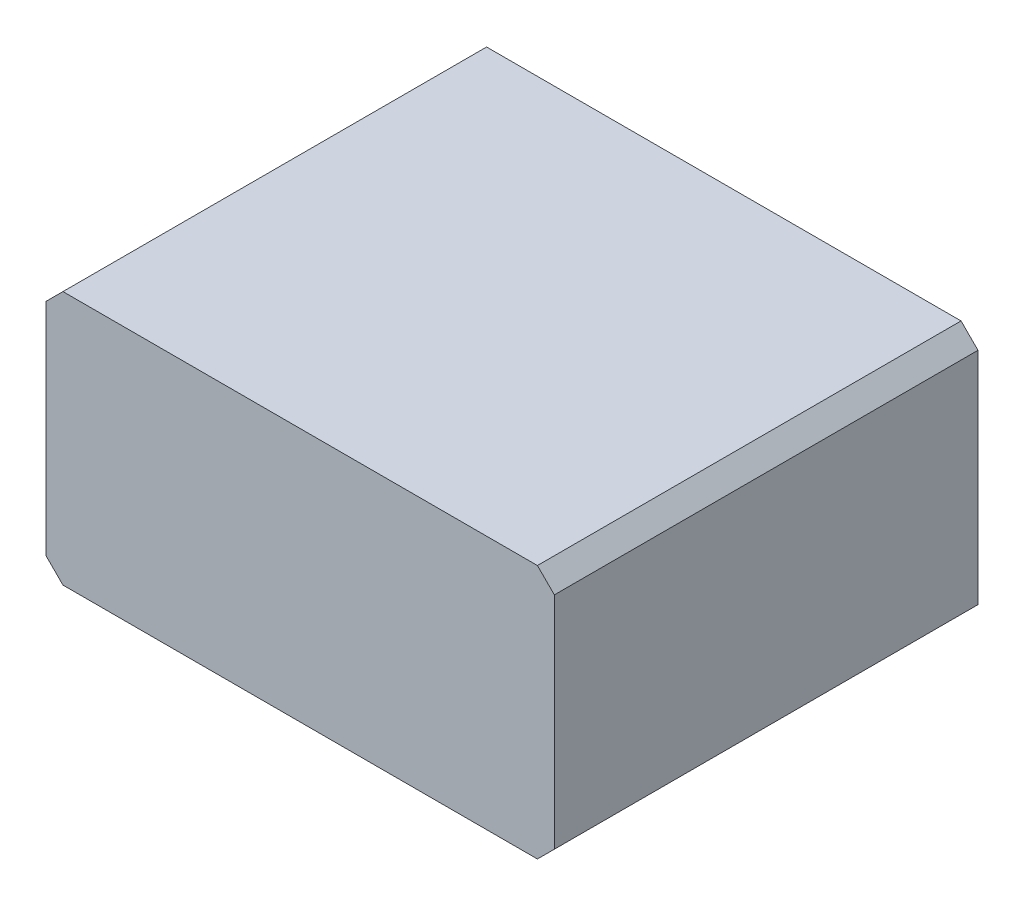
ISO-10303-21;
HEADER;
FILE_DESCRIPTION(('STEP AP214'),'2;1');
FILE_NAME('part.step','',(''),(''),'','','');
FILE_SCHEMA(('AUTOMOTIVE_DESIGN { 1 0 10303 214 1 1 1 1 }'));
ENDSEC;
DATA;
#1=APPLICATION_CONTEXT('core data for automotive mechanical design processes');
#2=APPLICATION_PROTOCOL_DEFINITION('international standard','automotive_design',2000,#1);
#3=PRODUCT_CONTEXT('',#1,'mechanical');
#4=PRODUCT('Part','Part','',(#3));
#5=PRODUCT_RELATED_PRODUCT_CATEGORY('part','',(#4));
#6=PRODUCT_DEFINITION_FORMATION('','',#4);
#7=PRODUCT_DEFINITION_CONTEXT('part definition',#1,'design');
#8=PRODUCT_DEFINITION('design','',#6,#7);
#9=PRODUCT_DEFINITION_SHAPE('','',#8);
#10=(LENGTH_UNIT() NAMED_UNIT(*) SI_UNIT(.MILLI.,.METRE.));
#11=(NAMED_UNIT(*) PLANE_ANGLE_UNIT() SI_UNIT($,.RADIAN.));
#12=(NAMED_UNIT(*) SI_UNIT($,.STERADIAN.) SOLID_ANGLE_UNIT());
#13=UNCERTAINTY_MEASURE_WITH_UNIT(LENGTH_MEASURE(1.E-05),#10,'distance_accuracy_value','');
#14=(GEOMETRIC_REPRESENTATION_CONTEXT(3) GLOBAL_UNCERTAINTY_ASSIGNED_CONTEXT((#13)) GLOBAL_UNIT_ASSIGNED_CONTEXT((#10,
#11,#12)) REPRESENTATION_CONTEXT('',''));
#15=CARTESIAN_POINT('',(0.,0.,0.));
#16=DIRECTION('',(0.,0.,1.));
#17=DIRECTION('',(1.,0.,0.));
#18=AXIS2_PLACEMENT_3D('',#15,#16,#17);
#19=CARTESIAN_POINT('',(30.,15.,25.));
#20=DIRECTION('',(-1.,0.,0.));
#21=DIRECTION('',(0.,0.,1.));
#22=AXIS2_PLACEMENT_3D('',#19,#20,#21);
#23=PLANE('',#22);
#24=DIRECTION('',(0.,1.,0.));
#25=VECTOR('',#24,1.);
#26=CARTESIAN_POINT('',(30.,15.,25.));
#27=LINE('',#26,#25);
#28=CARTESIAN_POINT('',(30.,-13.,25.));
#29=VERTEX_POINT('',#28);
#30=CARTESIAN_POINT('',(30.,13.,25.));
#31=VERTEX_POINT('',#30);
#32=EDGE_CURVE('E129',#29,#31,#27,.T.);
#33=ORIENTED_EDGE('',*,*,#32,.F.);
#34=DIRECTION('',(0.,0.,-1.));
#35=VECTOR('',#34,1.);
#36=CARTESIAN_POINT('',(30.,-13.,25.));
#37=LINE('',#36,#35);
#38=CARTESIAN_POINT('',(30.,-13.,-25.));
#39=VERTEX_POINT('',#38);
#40=EDGE_CURVE('E11',#29,#39,#37,.T.);
#41=ORIENTED_EDGE('',*,*,#40,.T.);
#42=DIRECTION('',(0.,1.,0.));
#43=VECTOR('',#42,1.);
#44=CARTESIAN_POINT('',(30.,15.,-25.));
#45=LINE('',#44,#43);
#46=CARTESIAN_POINT('',(30.,13.,-25.));
#47=VERTEX_POINT('',#46);
#48=EDGE_CURVE('E160',#39,#47,#45,.T.);
#49=ORIENTED_EDGE('',*,*,#48,.T.);
#50=DIRECTION('',(0.,0.,1.));
#51=VECTOR('',#50,1.);
#52=CARTESIAN_POINT('',(30.,13.,25.));
#53=LINE('',#52,#51);
#54=EDGE_CURVE('E43',#47,#31,#53,.T.);
#55=ORIENTED_EDGE('',*,*,#54,.T.);
#56=EDGE_LOOP('',(#33,#41,#49,#55));
#57=FACE_BOUND('',#56,.T.);
#58=ADVANCED_FACE('F35',(#57),#23,.F.);
#59=CARTESIAN_POINT('',(-30.,15.,25.));
#60=DIRECTION('',(0.,-1.,0.));
#61=DIRECTION('',(0.,0.,-1.));
#62=AXIS2_PLACEMENT_3D('',#59,#60,#61);
#63=PLANE('',#62);
#64=DIRECTION('',(-1.,0.,0.));
#65=VECTOR('',#64,1.);
#66=CARTESIAN_POINT('',(-30.,15.,-25.));
#67=LINE('',#66,#65);
#68=CARTESIAN_POINT('',(28.,15.,-25.));
#69=VERTEX_POINT('',#68);
#70=CARTESIAN_POINT('',(-28.,15.,-25.));
#71=VERTEX_POINT('',#70);
#72=EDGE_CURVE('E134',#69,#71,#67,.T.);
#73=ORIENTED_EDGE('',*,*,#72,.T.);
#74=DIRECTION('',(0.,0.,1.));
#75=VECTOR('',#74,1.);
#76=CARTESIAN_POINT('',(-28.,15.,25.));
#77=LINE('',#76,#75);
#78=CARTESIAN_POINT('',(-28.,15.,25.));
#79=VERTEX_POINT('',#78);
#80=EDGE_CURVE('E50',#71,#79,#77,.T.);
#81=ORIENTED_EDGE('',*,*,#80,.T.);
#82=DIRECTION('',(-1.,0.,0.));
#83=VECTOR('',#82,1.);
#84=CARTESIAN_POINT('',(-30.,15.,25.));
#85=LINE('',#84,#83);
#86=CARTESIAN_POINT('',(28.,15.,25.));
#87=VERTEX_POINT('',#86);
#88=EDGE_CURVE('E132',#87,#79,#85,.T.);
#89=ORIENTED_EDGE('',*,*,#88,.F.);
#90=DIRECTION('',(0.,0.,-1.));
#91=VECTOR('',#90,1.);
#92=CARTESIAN_POINT('',(28.,15.,25.));
#93=LINE('',#92,#91);
#94=EDGE_CURVE('E152',#87,#69,#93,.T.);
#95=ORIENTED_EDGE('',*,*,#94,.T.);
#96=EDGE_LOOP('',(#73,#81,#89,#95));
#97=FACE_BOUND('',#96,.T.);
#98=ADVANCED_FACE('F167',(#97),#63,.F.);
#99=CARTESIAN_POINT('',(-30.,15.,25.));
#100=DIRECTION('',(1.,0.,0.));
#101=DIRECTION('',(0.,0.,-1.));
#102=AXIS2_PLACEMENT_3D('',#99,#100,#101);
#103=PLANE('',#102);
#104=DIRECTION('',(0.,-1.,0.));
#105=VECTOR('',#104,1.);
#106=CARTESIAN_POINT('',(-30.,15.,-25.));
#107=LINE('',#106,#105);
#108=CARTESIAN_POINT('',(-30.,13.,-25.));
#109=VERTEX_POINT('',#108);
#110=CARTESIAN_POINT('',(-30.,-13.,-25.));
#111=VERTEX_POINT('',#110);
#112=EDGE_CURVE('E130',#109,#111,#107,.T.);
#113=ORIENTED_EDGE('',*,*,#112,.T.);
#114=DIRECTION('',(0.,0.,1.));
#115=VECTOR('',#114,1.);
#116=CARTESIAN_POINT('',(-30.,-13.,25.));
#117=LINE('',#116,#115);
#118=CARTESIAN_POINT('',(-30.,-13.,25.));
#119=VERTEX_POINT('',#118);
#120=EDGE_CURVE('E107',#111,#119,#117,.T.);
#121=ORIENTED_EDGE('',*,*,#120,.T.);
#122=DIRECTION('',(0.,-1.,0.));
#123=VECTOR('',#122,1.);
#124=CARTESIAN_POINT('',(-30.,15.,25.));
#125=LINE('',#124,#123);
#126=CARTESIAN_POINT('',(-30.,13.,25.));
#127=VERTEX_POINT('',#126);
#128=EDGE_CURVE('E171',#127,#119,#125,.T.);
#129=ORIENTED_EDGE('',*,*,#128,.F.);
#130=DIRECTION('',(0.,0.,-1.));
#131=VECTOR('',#130,1.);
#132=CARTESIAN_POINT('',(-30.,13.,25.));
#133=LINE('',#132,#131);
#134=EDGE_CURVE('E112',#127,#109,#133,.T.);
#135=ORIENTED_EDGE('',*,*,#134,.T.);
#136=EDGE_LOOP('',(#113,#121,#129,#135));
#137=FACE_BOUND('',#136,.T.);
#138=ADVANCED_FACE('F179',(#137),#103,.F.);
#139=CARTESIAN_POINT('',(-30.,-15.,25.));
#140=DIRECTION('',(0.,1.,0.));
#141=DIRECTION('',(0.,0.,1.));
#142=AXIS2_PLACEMENT_3D('',#139,#140,#141);
#143=PLANE('',#142);
#144=DIRECTION('',(1.,0.,0.));
#145=VECTOR('',#144,1.);
#146=CARTESIAN_POINT('',(-30.,-15.,25.));
#147=LINE('',#146,#145);
#148=CARTESIAN_POINT('',(-28.,-15.,25.));
#149=VERTEX_POINT('',#148);
#150=CARTESIAN_POINT('',(28.,-15.,25.));
#151=VERTEX_POINT('',#150);
#152=EDGE_CURVE('E122',#149,#151,#147,.T.);
#153=ORIENTED_EDGE('',*,*,#152,.F.);
#154=DIRECTION('',(0.,0.,-1.));
#155=VECTOR('',#154,1.);
#156=CARTESIAN_POINT('',(-28.,-15.,25.));
#157=LINE('',#156,#155);
#158=CARTESIAN_POINT('',(-28.,-15.,-25.));
#159=VERTEX_POINT('',#158);
#160=EDGE_CURVE('E106',#149,#159,#157,.T.);
#161=ORIENTED_EDGE('',*,*,#160,.T.);
#162=DIRECTION('',(1.,0.,0.));
#163=VECTOR('',#162,1.);
#164=CARTESIAN_POINT('',(-30.,-15.,-25.));
#165=LINE('',#164,#163);
#166=CARTESIAN_POINT('',(28.,-15.,-25.));
#167=VERTEX_POINT('',#166);
#168=EDGE_CURVE('E119',#159,#167,#165,.T.);
#169=ORIENTED_EDGE('',*,*,#168,.T.);
#170=DIRECTION('',(0.,0.,1.));
#171=VECTOR('',#170,1.);
#172=CARTESIAN_POINT('',(28.,-15.,25.));
#173=LINE('',#172,#171);
#174=EDGE_CURVE('E124',#167,#151,#173,.T.);
#175=ORIENTED_EDGE('',*,*,#174,.T.);
#176=EDGE_LOOP('',(#153,#161,#169,#175));
#177=FACE_BOUND('',#176,.T.);
#178=ADVANCED_FACE('F118',(#177),#143,.F.);
#179=CARTESIAN_POINT('',(0.,0.,25.));
#180=DIRECTION('',(0.,0.,1.));
#181=DIRECTION('',(1.,0.,0.));
#182=AXIS2_PLACEMENT_3D('',#179,#180,#181);
#183=PLANE('',#182);
#184=ORIENTED_EDGE('',*,*,#128,.T.);
#185=DIRECTION('',(-0.707106781186547,0.707106781186548,0.));
#186=VECTOR('',#185,1.);
#187=CARTESIAN_POINT('',(-21.5,-21.5,25.));
#188=LINE('',#187,#186);
#189=EDGE_CURVE('E150',#119,#149,#188,.F.);
#190=ORIENTED_EDGE('',*,*,#189,.T.);
#191=ORIENTED_EDGE('',*,*,#152,.T.);
#192=DIRECTION('',(-0.707106781186548,-0.707106781186547,0.));
#193=VECTOR('',#192,1.);
#194=CARTESIAN_POINT('',(21.5,-21.5,25.));
#195=LINE('',#194,#193);
#196=EDGE_CURVE('E146',#151,#29,#195,.F.);
#197=ORIENTED_EDGE('',*,*,#196,.T.);
#198=ORIENTED_EDGE('',*,*,#32,.T.);
#199=DIRECTION('',(0.707106781186548,-0.707106781186548,0.));
#200=VECTOR('',#199,1.);
#201=CARTESIAN_POINT('',(21.5,21.5,25.));
#202=LINE('',#201,#200);
#203=EDGE_CURVE('E57',#31,#87,#202,.F.);
#204=ORIENTED_EDGE('',*,*,#203,.T.);
#205=ORIENTED_EDGE('',*,*,#88,.T.);
#206=DIRECTION('',(0.707106781186549,0.707106781186546,0.));
#207=VECTOR('',#206,1.);
#208=CARTESIAN_POINT('',(-21.5,21.5,25.));
#209=LINE('',#208,#207);
#210=EDGE_CURVE('E148',#79,#127,#209,.F.);
#211=ORIENTED_EDGE('',*,*,#210,.T.);
#212=EDGE_LOOP('',(#184,#190,#191,#197,#198,#204,#205,#211));
#213=FACE_BOUND('',#212,.T.);
#214=ADVANCED_FACE('F163',(#213),#183,.T.);
#215=CARTESIAN_POINT('',(0.,0.,-25.));
#216=DIRECTION('',(0.,0.,1.));
#217=DIRECTION('',(1.,0.,0.));
#218=AXIS2_PLACEMENT_3D('',#215,#216,#217);
#219=PLANE('',#218);
#220=ORIENTED_EDGE('',*,*,#168,.F.);
#221=DIRECTION('',(0.707106781186547,-0.707106781186548,0.));
#222=VECTOR('',#221,1.);
#223=CARTESIAN_POINT('',(-28.,-15.,-25.));
#224=LINE('',#223,#222);
#225=EDGE_CURVE('E102',#159,#111,#224,.F.);
#226=ORIENTED_EDGE('',*,*,#225,.T.);
#227=ORIENTED_EDGE('',*,*,#112,.F.);
#228=DIRECTION('',(-0.707106781186549,-0.707106781186546,0.));
#229=VECTOR('',#228,1.);
#230=CARTESIAN_POINT('',(-30.,13.,-25.));
#231=LINE('',#230,#229);
#232=EDGE_CURVE('E113',#109,#71,#231,.F.);
#233=ORIENTED_EDGE('',*,*,#232,.T.);
#234=ORIENTED_EDGE('',*,*,#72,.F.);
#235=DIRECTION('',(-0.707106781186548,0.707106781186548,0.));
#236=VECTOR('',#235,1.);
#237=CARTESIAN_POINT('',(28.,15.,-25.));
#238=LINE('',#237,#236);
#239=EDGE_CURVE('E123',#69,#47,#238,.F.);
#240=ORIENTED_EDGE('',*,*,#239,.T.);
#241=ORIENTED_EDGE('',*,*,#48,.F.);
#242=DIRECTION('',(0.707106781186548,0.707106781186547,0.));
#243=VECTOR('',#242,1.);
#244=CARTESIAN_POINT('',(30.,-13.,-25.));
#245=LINE('',#244,#243);
#246=EDGE_CURVE('E128',#39,#167,#245,.F.);
#247=ORIENTED_EDGE('',*,*,#246,.T.);
#248=EDGE_LOOP('',(#220,#226,#227,#233,#234,#240,#241,#247));
#249=FACE_BOUND('',#248,.T.);
#250=ADVANCED_FACE('F126',(#249),#219,.F.);
#251=CARTESIAN_POINT('',(-28.,-15.,25.));
#252=DIRECTION('',(0.707106781186548,0.707106781186547,0.));
#253=DIRECTION('',(0.,0.,-1.));
#254=AXIS2_PLACEMENT_3D('',#251,#252,#253);
#255=PLANE('',#254);
#256=ORIENTED_EDGE('',*,*,#189,.F.);
#257=ORIENTED_EDGE('',*,*,#120,.F.);
#258=ORIENTED_EDGE('',*,*,#225,.F.);
#259=ORIENTED_EDGE('',*,*,#160,.F.);
#260=EDGE_LOOP('',(#256,#257,#258,#259));
#261=FACE_BOUND('',#260,.T.);
#262=ADVANCED_FACE('F105',(#261),#255,.F.);
#263=CARTESIAN_POINT('',(-30.,13.,25.));
#264=DIRECTION('',(0.707106781186546,-0.707106781186549,0.));
#265=DIRECTION('',(0.,0.,-1.));
#266=AXIS2_PLACEMENT_3D('',#263,#264,#265);
#267=PLANE('',#266);
#268=ORIENTED_EDGE('',*,*,#210,.F.);
#269=ORIENTED_EDGE('',*,*,#80,.F.);
#270=ORIENTED_EDGE('',*,*,#232,.F.);
#271=ORIENTED_EDGE('',*,*,#134,.F.);
#272=EDGE_LOOP('',(#268,#269,#270,#271));
#273=FACE_BOUND('',#272,.T.);
#274=ADVANCED_FACE('F177',(#273),#267,.F.);
#275=CARTESIAN_POINT('',(30.,-13.,25.));
#276=DIRECTION('',(-0.707106781186547,0.707106781186548,0.));
#277=DIRECTION('',(0.,0.,-1.));
#278=AXIS2_PLACEMENT_3D('',#275,#276,#277);
#279=PLANE('',#278);
#280=ORIENTED_EDGE('',*,*,#196,.F.);
#281=ORIENTED_EDGE('',*,*,#174,.F.);
#282=ORIENTED_EDGE('',*,*,#246,.F.);
#283=ORIENTED_EDGE('',*,*,#40,.F.);
#284=EDGE_LOOP('',(#280,#281,#282,#283));
#285=FACE_BOUND('',#284,.T.);
#286=ADVANCED_FACE('F181',(#285),#279,.F.);
#287=CARTESIAN_POINT('',(28.,15.,25.));
#288=DIRECTION('',(-0.707106781186547,-0.707106781186547,0.));
#289=DIRECTION('',(0.,0.,-1.));
#290=AXIS2_PLACEMENT_3D('',#287,#288,#289);
#291=PLANE('',#290);
#292=ORIENTED_EDGE('',*,*,#203,.F.);
#293=ORIENTED_EDGE('',*,*,#54,.F.);
#294=ORIENTED_EDGE('',*,*,#239,.F.);
#295=ORIENTED_EDGE('',*,*,#94,.F.);
#296=EDGE_LOOP('',(#292,#293,#294,#295));
#297=FACE_BOUND('',#296,.T.);
#298=ADVANCED_FACE('F37',(#297),#291,.F.);
#299=CLOSED_SHELL('',(#58,#98,#138,#178,#214,#250,#262,#274,#286,#298));
#300=MANIFOLD_SOLID_BREP('B2',#299);
#301=ADVANCED_BREP_SHAPE_REPRESENTATION('',(#18,#300),#14);
#302=SHAPE_DEFINITION_REPRESENTATION(#9,#301);
ENDSEC;
END-ISO-10303-21;
